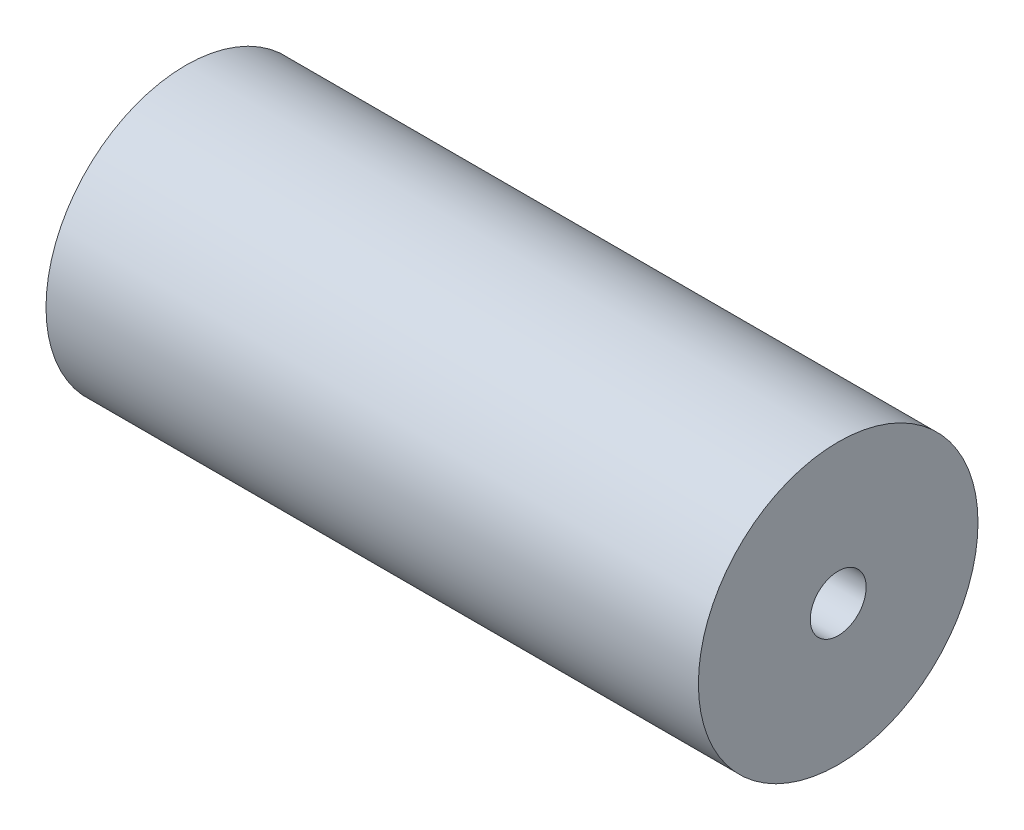
ISO-10303-21;
HEADER;
FILE_DESCRIPTION(('STEP AP214'),'2;1');
FILE_NAME('part.step','',(''),(''),'','','');
FILE_SCHEMA(('AUTOMOTIVE_DESIGN { 1 0 10303 214 1 1 1 1 }'));
ENDSEC;
DATA;
#1=APPLICATION_CONTEXT('core data for automotive mechanical design processes');
#2=APPLICATION_PROTOCOL_DEFINITION('international standard','automotive_design',2000,#1);
#3=PRODUCT_CONTEXT('',#1,'mechanical');
#4=PRODUCT('Part','Part','',(#3));
#5=PRODUCT_RELATED_PRODUCT_CATEGORY('part','',(#4));
#6=PRODUCT_DEFINITION_FORMATION('','',#4);
#7=PRODUCT_DEFINITION_CONTEXT('part definition',#1,'design');
#8=PRODUCT_DEFINITION('design','',#6,#7);
#9=PRODUCT_DEFINITION_SHAPE('','',#8);
#10=(LENGTH_UNIT() NAMED_UNIT(*) SI_UNIT(.MILLI.,.METRE.));
#11=(NAMED_UNIT(*) PLANE_ANGLE_UNIT() SI_UNIT($,.RADIAN.));
#12=(NAMED_UNIT(*) SI_UNIT($,.STERADIAN.) SOLID_ANGLE_UNIT());
#13=UNCERTAINTY_MEASURE_WITH_UNIT(LENGTH_MEASURE(1.E-05),#10,'distance_accuracy_value','');
#14=(GEOMETRIC_REPRESENTATION_CONTEXT(3) GLOBAL_UNCERTAINTY_ASSIGNED_CONTEXT((#13)) GLOBAL_UNIT_ASSIGNED_CONTEXT((#10,
#11,#12)) REPRESENTATION_CONTEXT('',''));
#15=CARTESIAN_POINT('',(0.,0.,0.));
#16=DIRECTION('',(0.,0.,1.));
#17=DIRECTION('',(1.,0.,0.));
#18=AXIS2_PLACEMENT_3D('',#15,#16,#17);
#19=CARTESIAN_POINT('',(22.225,1.905,0.));
#20=DIRECTION('',(-1.,0.,0.));
#21=DIRECTION('',(0.,-1.,0.));
#22=AXIS2_PLACEMENT_3D('',#19,#20,#21);
#23=PLANE('',#22);
#24=CARTESIAN_POINT('',(22.225,0.,0.));
#25=DIRECTION('',(-1.,0.,0.));
#26=DIRECTION('',(0.,-1.,0.));
#27=AXIS2_PLACEMENT_3D('',#24,#25,#26);
#28=CIRCLE('',#27,9.525);
#29=CARTESIAN_POINT('',(22.225,-9.52499999999999,0.));
#30=VERTEX_POINT('',#29);
#31=EDGE_CURVE('E45',#30,#30,#28,.T.);
#32=ORIENTED_EDGE('',*,*,#31,.F.);
#33=EDGE_LOOP('',(#32));
#34=FACE_BOUND('',#33,.T.);
#35=CARTESIAN_POINT('',(22.225,0.,0.));
#36=DIRECTION('',(-1.,0.,0.));
#37=DIRECTION('',(0.,-1.,0.));
#38=AXIS2_PLACEMENT_3D('',#35,#36,#37);
#39=CIRCLE('',#38,1.90499999999999);
#40=CARTESIAN_POINT('',(22.225,-1.90499999999998,0.));
#41=VERTEX_POINT('',#40);
#42=EDGE_CURVE('E10',#41,#41,#39,.T.);
#43=ORIENTED_EDGE('',*,*,#42,.T.);
#44=EDGE_LOOP('',(#43));
#45=FACE_BOUND('',#44,.T.);
#46=ADVANCED_FACE('F31',(#34,#45),#23,.F.);
#47=CARTESIAN_POINT('',(-22.225,0.,0.));
#48=DIRECTION('',(-1.,0.,0.));
#49=DIRECTION('',(0.,-1.,0.));
#50=AXIS2_PLACEMENT_3D('',#47,#48,#49);
#51=CYLINDRICAL_SURFACE('',#50,1.905);
#52=ORIENTED_EDGE('',*,*,#42,.F.);
#53=EDGE_LOOP('',(#52));
#54=FACE_BOUND('',#53,.T.);
#55=CARTESIAN_POINT('',(-22.225,0.,0.));
#56=DIRECTION('',(-1.,0.,0.));
#57=DIRECTION('',(0.,-1.,0.));
#58=AXIS2_PLACEMENT_3D('',#55,#56,#57);
#59=CIRCLE('',#58,1.905);
#60=CARTESIAN_POINT('',(-22.225,-1.905,0.));
#61=VERTEX_POINT('',#60);
#62=EDGE_CURVE('E37',#61,#61,#59,.T.);
#63=ORIENTED_EDGE('',*,*,#62,.T.);
#64=EDGE_LOOP('',(#63));
#65=FACE_BOUND('',#64,.T.);
#66=ADVANCED_FACE('F54',(#54,#65),#51,.F.);
#67=CARTESIAN_POINT('',(-22.225,1.905,0.));
#68=DIRECTION('',(1.,0.,0.));
#69=DIRECTION('',(0.,1.,0.));
#70=AXIS2_PLACEMENT_3D('',#67,#68,#69);
#71=PLANE('',#70);
#72=ORIENTED_EDGE('',*,*,#62,.F.);
#73=EDGE_LOOP('',(#72));
#74=FACE_BOUND('',#73,.T.);
#75=CARTESIAN_POINT('',(-22.225,0.,0.));
#76=DIRECTION('',(-1.,0.,0.));
#77=DIRECTION('',(0.,-1.,0.));
#78=AXIS2_PLACEMENT_3D('',#75,#76,#77);
#79=CIRCLE('',#78,9.525);
#80=CARTESIAN_POINT('',(-22.225,-9.525,0.));
#81=VERTEX_POINT('',#80);
#82=EDGE_CURVE('E41',#81,#81,#79,.T.);
#83=ORIENTED_EDGE('',*,*,#82,.T.);
#84=EDGE_LOOP('',(#83));
#85=FACE_BOUND('',#84,.T.);
#86=ADVANCED_FACE('F58',(#74,#85),#71,.F.);
#87=CARTESIAN_POINT('',(-22.225,0.,0.));
#88=DIRECTION('',(-1.,0.,0.));
#89=DIRECTION('',(0.,-1.,0.));
#90=AXIS2_PLACEMENT_3D('',#87,#88,#89);
#91=CYLINDRICAL_SURFACE('',#90,9.525);
#92=ORIENTED_EDGE('',*,*,#82,.F.);
#93=EDGE_LOOP('',(#92));
#94=FACE_BOUND('',#93,.T.);
#95=ORIENTED_EDGE('',*,*,#31,.T.);
#96=EDGE_LOOP('',(#95));
#97=FACE_BOUND('',#96,.T.);
#98=ADVANCED_FACE('F51',(#94,#97),#91,.T.);
#99=CLOSED_SHELL('',(#46,#66,#86,#98));
#100=MANIFOLD_SOLID_BREP('B2',#99);
#101=ADVANCED_BREP_SHAPE_REPRESENTATION('',(#18,#100),#14);
#102=SHAPE_DEFINITION_REPRESENTATION(#9,#101);
ENDSEC;
END-ISO-10303-21;
